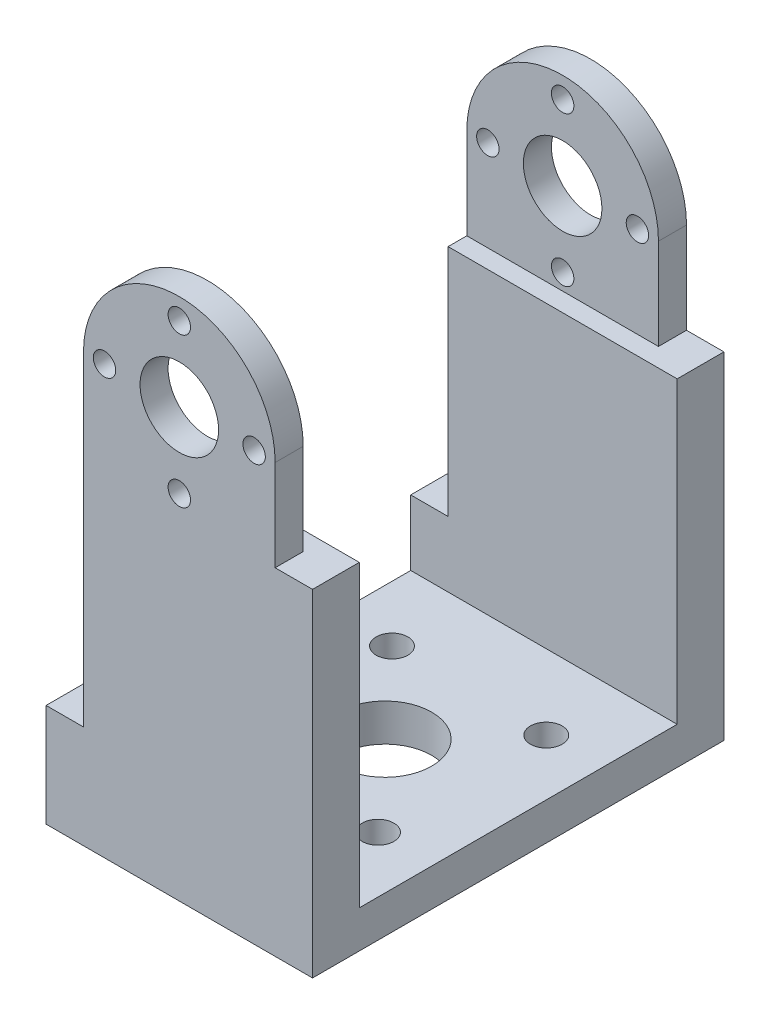
ISO-10303-21;
HEADER;
FILE_DESCRIPTION(('STEP AP214'),'2;1');
FILE_NAME('part.step','',(''),(''),'','','');
FILE_SCHEMA(('AUTOMOTIVE_DESIGN { 1 0 10303 214 1 1 1 1 }'));
ENDSEC;
DATA;
#1=APPLICATION_CONTEXT('core data for automotive mechanical design processes');
#2=APPLICATION_PROTOCOL_DEFINITION('international standard','automotive_design',2000,#1);
#3=PRODUCT_CONTEXT('',#1,'mechanical');
#4=PRODUCT('Part','Part','',(#3));
#5=PRODUCT_RELATED_PRODUCT_CATEGORY('part','',(#4));
#6=PRODUCT_DEFINITION_FORMATION('','',#4);
#7=PRODUCT_DEFINITION_CONTEXT('part definition',#1,'design');
#8=PRODUCT_DEFINITION('design','',#6,#7);
#9=PRODUCT_DEFINITION_SHAPE('','',#8);
#10=(LENGTH_UNIT() NAMED_UNIT(*) SI_UNIT(.MILLI.,.METRE.));
#11=(NAMED_UNIT(*) PLANE_ANGLE_UNIT() SI_UNIT($,.RADIAN.));
#12=(NAMED_UNIT(*) SI_UNIT($,.STERADIAN.) SOLID_ANGLE_UNIT());
#13=UNCERTAINTY_MEASURE_WITH_UNIT(LENGTH_MEASURE(1.E-05),#10,'distance_accuracy_value','');
#14=(GEOMETRIC_REPRESENTATION_CONTEXT(3) GLOBAL_UNCERTAINTY_ASSIGNED_CONTEXT((#13)) GLOBAL_UNIT_ASSIGNED_CONTEXT((#10,
#11,#12)) REPRESENTATION_CONTEXT('',''));
#15=CARTESIAN_POINT('',(0.,0.,0.));
#16=DIRECTION('',(0.,0.,1.));
#17=DIRECTION('',(1.,0.,0.));
#18=AXIS2_PLACEMENT_3D('',#15,#16,#17);
#19=CARTESIAN_POINT('',(17.25,-9.75,-17.));
#20=DIRECTION('',(0.,0.,-1.));
#21=DIRECTION('',(-1.,0.,0.));
#22=AXIS2_PLACEMENT_3D('',#19,#20,#21);
#23=PLANE('',#22);
#24=DIRECTION('',(0.,-1.,0.));
#25=VECTOR('',#24,1.);
#26=CARTESIAN_POINT('',(-10.25,-9.75,-17.));
#27=LINE('',#26,#25);
#28=CARTESIAN_POINT('',(-10.25,-9.75,-17.));
#29=VERTEX_POINT('',#28);
#30=CARTESIAN_POINT('',(-10.25,-34.75,-17.));
#31=VERTEX_POINT('',#30);
#32=EDGE_CURVE('E477',#29,#31,#27,.T.);
#33=ORIENTED_EDGE('',*,*,#32,.T.);
#34=DIRECTION('',(-1.,0.,0.));
#35=VECTOR('',#34,1.);
#36=CARTESIAN_POINT('',(17.25,-34.75,-17.));
#37=LINE('',#36,#35);
#38=CARTESIAN_POINT('',(-14.25,-34.75,-17.));
#39=VERTEX_POINT('',#38);
#40=EDGE_CURVE('E205',#31,#39,#37,.T.);
#41=ORIENTED_EDGE('',*,*,#40,.T.);
#42=DIRECTION('',(0.,-1.,0.));
#43=VECTOR('',#42,1.);
#44=CARTESIAN_POINT('',(-14.25,-9.74999999999999,-17.));
#45=LINE('',#44,#43);
#46=CARTESIAN_POINT('',(-14.25,-41.75,-17.));
#47=VERTEX_POINT('',#46);
#48=EDGE_CURVE('E218',#39,#47,#45,.T.);
#49=ORIENTED_EDGE('',*,*,#48,.T.);
#50=DIRECTION('',(1.,0.,0.));
#51=VECTOR('',#50,1.);
#52=CARTESIAN_POINT('',(0.,-41.75,-17.));
#53=LINE('',#52,#51);
#54=CARTESIAN_POINT('',(14.25,-41.75,-17.));
#55=VERTEX_POINT('',#54);
#56=EDGE_CURVE('E345',#47,#55,#53,.T.);
#57=ORIENTED_EDGE('',*,*,#56,.T.);
#58=DIRECTION('',(0.,1.,0.));
#59=VECTOR('',#58,1.);
#60=CARTESIAN_POINT('',(14.25,-9.75,-17.));
#61=LINE('',#60,#59);
#62=CARTESIAN_POINT('',(14.25,-9.75,-17.));
#63=VERTEX_POINT('',#62);
#64=EDGE_CURVE('E225',#55,#63,#61,.T.);
#65=ORIENTED_EDGE('',*,*,#64,.T.);
#66=DIRECTION('',(-1.,0.,0.));
#67=VECTOR('',#66,1.);
#68=CARTESIAN_POINT('',(17.25,-9.75,-17.));
#69=LINE('',#68,#67);
#70=EDGE_CURVE('E11',#63,#29,#69,.T.);
#71=ORIENTED_EDGE('',*,*,#70,.T.);
#72=EDGE_LOOP('',(#33,#41,#49,#57,#65,#71));
#73=FACE_BOUND('',#72,.T.);
#74=ADVANCED_FACE('F47',(#73),#23,.F.);
#75=CARTESIAN_POINT('',(10.25,-9.75,-19.));
#76=DIRECTION('',(0.,-1.,0.));
#77=DIRECTION('',(0.,0.,-1.));
#78=AXIS2_PLACEMENT_3D('',#75,#76,#77);
#79=PLANE('',#78);
#80=DIRECTION('',(-1.,0.,0.));
#81=VECTOR('',#80,1.);
#82=CARTESIAN_POINT('',(10.25,-9.75,-19.));
#83=LINE('',#82,#81);
#84=CARTESIAN_POINT('',(10.25,-9.75,-19.));
#85=VERTEX_POINT('',#84);
#86=CARTESIAN_POINT('',(-10.25,-9.75,-19.));
#87=VERTEX_POINT('',#86);
#88=EDGE_CURVE('E394',#85,#87,#83,.T.);
#89=ORIENTED_EDGE('',*,*,#88,.T.);
#90=DIRECTION('',(0.,0.,-1.));
#91=VECTOR('',#90,1.);
#92=CARTESIAN_POINT('',(-10.25,-9.75,22.));
#93=LINE('',#92,#91);
#94=EDGE_CURVE('E197',#29,#87,#93,.T.);
#95=ORIENTED_EDGE('',*,*,#94,.F.);
#96=ORIENTED_EDGE('',*,*,#70,.F.);
#97=DIRECTION('',(0.,0.,-1.));
#98=VECTOR('',#97,1.);
#99=CARTESIAN_POINT('',(14.25,-9.75,22.));
#100=LINE('',#99,#98);
#101=CARTESIAN_POINT('',(14.25,-9.75,-22.));
#102=VERTEX_POINT('',#101);
#103=EDGE_CURVE('E487',#63,#102,#100,.T.);
#104=ORIENTED_EDGE('',*,*,#103,.T.);
#105=DIRECTION('',(-1.,0.,0.));
#106=VECTOR('',#105,1.);
#107=CARTESIAN_POINT('',(10.25,-9.75,-22.));
#108=LINE('',#107,#106);
#109=CARTESIAN_POINT('',(10.25,-9.75,-22.));
#110=VERTEX_POINT('',#109);
#111=EDGE_CURVE('E349',#102,#110,#108,.T.);
#112=ORIENTED_EDGE('',*,*,#111,.T.);
#113=DIRECTION('',(0.,0.,1.));
#114=VECTOR('',#113,1.);
#115=CARTESIAN_POINT('',(10.25,-9.75,-22.));
#116=LINE('',#115,#114);
#117=EDGE_CURVE('E51',#110,#85,#116,.T.);
#118=ORIENTED_EDGE('',*,*,#117,.T.);
#119=EDGE_LOOP('',(#89,#95,#96,#104,#112,#118));
#120=FACE_BOUND('',#119,.T.);
#121=ADVANCED_FACE('F498',(#120),#79,.F.);
#122=CARTESIAN_POINT('',(0.,-45.75,0.));
#123=DIRECTION('',(0.,-1.,0.));
#124=DIRECTION('',(0.,0.,-1.));
#125=AXIS2_PLACEMENT_3D('',#122,#123,#124);
#126=PLANE('',#125);
#127=DIRECTION('',(0.,0.,-1.));
#128=VECTOR('',#127,1.);
#129=CARTESIAN_POINT('',(14.25,-45.75,0.));
#130=LINE('',#129,#128);
#131=CARTESIAN_POINT('',(14.25,-45.75,22.));
#132=VERTEX_POINT('',#131);
#133=CARTESIAN_POINT('',(14.25,-45.75,-22.));
#134=VERTEX_POINT('',#133);
#135=EDGE_CURVE('E369',#132,#134,#130,.T.);
#136=ORIENTED_EDGE('',*,*,#135,.F.);
#137=DIRECTION('',(1.,0.,0.));
#138=VECTOR('',#137,1.);
#139=CARTESIAN_POINT('',(-10.25,-45.75,22.));
#140=LINE('',#139,#138);
#141=CARTESIAN_POINT('',(-14.25,-45.75,22.));
#142=VERTEX_POINT('',#141);
#143=EDGE_CURVE('E241',#142,#132,#140,.T.);
#144=ORIENTED_EDGE('',*,*,#143,.F.);
#145=DIRECTION('',(0.,0.,-1.));
#146=VECTOR('',#145,1.);
#147=CARTESIAN_POINT('',(-14.25,-45.75,0.));
#148=LINE('',#147,#146);
#149=CARTESIAN_POINT('',(-14.25,-45.75,-22.));
#150=VERTEX_POINT('',#149);
#151=EDGE_CURVE('E201',#142,#150,#148,.T.);
#152=ORIENTED_EDGE('',*,*,#151,.T.);
#153=DIRECTION('',(-1.,0.,0.));
#154=VECTOR('',#153,1.);
#155=CARTESIAN_POINT('',(10.25,-45.75,-22.));
#156=LINE('',#155,#154);
#157=EDGE_CURVE('E389',#134,#150,#156,.T.);
#158=ORIENTED_EDGE('',*,*,#157,.F.);
#159=EDGE_LOOP('',(#136,#144,#152,#158));
#160=FACE_BOUND('',#159,.T.);
#161=CARTESIAN_POINT('',(-8.24999999999981,-45.75,-8.99999999999999));
#162=DIRECTION('',(0.,-1.,0.));
#163=DIRECTION('',(0.,0.,-1.));
#164=AXIS2_PLACEMENT_3D('',#161,#162,#163);
#165=CIRCLE('',#164,1.7);
#166=CARTESIAN_POINT('',(-8.24999999999981,-45.75,-10.7));
#167=VERTEX_POINT('',#166);
#168=EDGE_CURVE('E307',#167,#167,#165,.T.);
#169=ORIENTED_EDGE('',*,*,#168,.F.);
#170=EDGE_LOOP('',(#169));
#171=FACE_BOUND('',#170,.T.);
#172=CARTESIAN_POINT('',(8.2500000000002,-45.75,-8.99999999999999));
#173=DIRECTION('',(0.,-1.,0.));
#174=DIRECTION('',(0.,0.,-1.));
#175=AXIS2_PLACEMENT_3D('',#172,#173,#174);
#176=CIRCLE('',#175,1.7);
#177=CARTESIAN_POINT('',(8.2500000000002,-45.75,-10.7));
#178=VERTEX_POINT('',#177);
#179=EDGE_CURVE('E353',#178,#178,#176,.T.);
#180=ORIENTED_EDGE('',*,*,#179,.F.);
#181=EDGE_LOOP('',(#180));
#182=FACE_BOUND('',#181,.T.);
#183=CARTESIAN_POINT('',(8.25000000000001,-45.75,9.00000000000001));
#184=DIRECTION('',(0.,-1.,0.));
#185=DIRECTION('',(0.,0.,-1.));
#186=AXIS2_PLACEMENT_3D('',#183,#184,#185);
#187=CIRCLE('',#186,1.7);
#188=CARTESIAN_POINT('',(8.25000000000001,-45.75,7.30000000000001));
#189=VERTEX_POINT('',#188);
#190=EDGE_CURVE('E357',#189,#189,#187,.T.);
#191=ORIENTED_EDGE('',*,*,#190,.F.);
#192=EDGE_LOOP('',(#191));
#193=FACE_BOUND('',#192,.T.);
#194=CARTESIAN_POINT('',(-8.24999999999999,-45.75,9.00000000000001));
#195=DIRECTION('',(0.,-1.,0.));
#196=DIRECTION('',(0.,0.,-1.));
#197=AXIS2_PLACEMENT_3D('',#194,#195,#196);
#198=CIRCLE('',#197,1.7);
#199=CARTESIAN_POINT('',(-8.24999999999999,-45.75,7.30000000000001));
#200=VERTEX_POINT('',#199);
#201=EDGE_CURVE('E361',#200,#200,#198,.T.);
#202=ORIENTED_EDGE('',*,*,#201,.F.);
#203=EDGE_LOOP('',(#202));
#204=FACE_BOUND('',#203,.T.);
#205=CARTESIAN_POINT('',(0.,-45.75,0.));
#206=DIRECTION('',(0.,-1.,0.));
#207=DIRECTION('',(0.,0.,-1.));
#208=AXIS2_PLACEMENT_3D('',#205,#206,#207);
#209=CIRCLE('',#208,5.);
#210=CARTESIAN_POINT('',(0.,-45.75,-5.));
#211=VERTEX_POINT('',#210);
#212=EDGE_CURVE('E365',#211,#211,#209,.T.);
#213=ORIENTED_EDGE('',*,*,#212,.F.);
#214=EDGE_LOOP('',(#213));
#215=FACE_BOUND('',#214,.T.);
#216=ADVANCED_FACE('F49',(#160,#171,#182,#193,#204,#215),#126,.T.);
#217=CARTESIAN_POINT('',(-10.25,0.,-22.));
#218=DIRECTION('',(-1.,0.,0.));
#219=DIRECTION('',(0.,0.,1.));
#220=AXIS2_PLACEMENT_3D('',#217,#218,#219);
#221=PLANE('',#220);
#222=DIRECTION('',(0.,-1.,0.));
#223=VECTOR('',#222,1.);
#224=CARTESIAN_POINT('',(-10.25,0.,-22.));
#225=LINE('',#224,#223);
#226=CARTESIAN_POINT('',(-10.25,0.,-22.));
#227=VERTEX_POINT('',#226);
#228=CARTESIAN_POINT('',(-10.25,-34.75,-22.));
#229=VERTEX_POINT('',#228);
#230=EDGE_CURVE('E390',#227,#229,#225,.T.);
#231=ORIENTED_EDGE('',*,*,#230,.T.);
#232=DIRECTION('',(0.,0.,-1.));
#233=VECTOR('',#232,1.);
#234=CARTESIAN_POINT('',(-10.25,-34.75,22.));
#235=LINE('',#234,#233);
#236=EDGE_CURVE('E472',#31,#229,#235,.T.);
#237=ORIENTED_EDGE('',*,*,#236,.F.);
#238=ORIENTED_EDGE('',*,*,#32,.F.);
#239=ORIENTED_EDGE('',*,*,#94,.T.);
#240=DIRECTION('',(0.,-1.,0.));
#241=VECTOR('',#240,1.);
#242=CARTESIAN_POINT('',(-10.25,10.25,-19.));
#243=LINE('',#242,#241);
#244=CARTESIAN_POINT('',(-10.25,0.,-19.));
#245=VERTEX_POINT('',#244);
#246=EDGE_CURVE('E57',#245,#87,#243,.T.);
#247=ORIENTED_EDGE('',*,*,#246,.F.);
#248=DIRECTION('',(0.,0.,1.));
#249=VECTOR('',#248,1.);
#250=CARTESIAN_POINT('',(-10.25,0.,-22.));
#251=LINE('',#250,#249);
#252=EDGE_CURVE('E398',#227,#245,#251,.T.);
#253=ORIENTED_EDGE('',*,*,#252,.F.);
#254=EDGE_LOOP('',(#231,#237,#238,#239,#247,#253));
#255=FACE_BOUND('',#254,.T.);
#256=ADVANCED_FACE('F458',(#255),#221,.T.);
#257=CARTESIAN_POINT('',(0.,0.,-22.));
#258=DIRECTION('',(0.,0.,1.));
#259=DIRECTION('',(1.,0.,0.));
#260=AXIS2_PLACEMENT_3D('',#257,#258,#259);
#261=CYLINDRICAL_SURFACE('',#260,10.25);
#262=CARTESIAN_POINT('',(0.,0.,-19.));
#263=DIRECTION('',(0.,0.,-1.));
#264=DIRECTION('',(-1.,0.,0.));
#265=AXIS2_PLACEMENT_3D('',#262,#263,#264);
#266=CIRCLE('',#265,10.25);
#267=CARTESIAN_POINT('',(10.25,0.,-19.));
#268=VERTEX_POINT('',#267);
#269=EDGE_CURVE('E384',#268,#245,#266,.F.);
#270=ORIENTED_EDGE('',*,*,#269,.F.);
#271=DIRECTION('',(0.,0.,1.));
#272=VECTOR('',#271,1.);
#273=CARTESIAN_POINT('',(10.25,0.,-22.));
#274=LINE('',#273,#272);
#275=CARTESIAN_POINT('',(10.25,0.,-22.));
#276=VERTEX_POINT('',#275);
#277=EDGE_CURVE('E415',#276,#268,#274,.T.);
#278=ORIENTED_EDGE('',*,*,#277,.F.);
#279=CARTESIAN_POINT('',(0.,0.,-22.));
#280=DIRECTION('',(0.,0.,1.));
#281=DIRECTION('',(1.,0.,0.));
#282=AXIS2_PLACEMENT_3D('',#279,#280,#281);
#283=CIRCLE('',#282,10.25);
#284=EDGE_CURVE('E393',#276,#227,#283,.T.);
#285=ORIENTED_EDGE('',*,*,#284,.T.);
#286=ORIENTED_EDGE('',*,*,#252,.T.);
#287=EDGE_LOOP('',(#270,#278,#285,#286));
#288=FACE_BOUND('',#287,.T.);
#289=ADVANCED_FACE('F453',(#288),#261,.T.);
#290=CARTESIAN_POINT('',(0.,0.,-22.));
#291=DIRECTION('',(0.,0.,1.));
#292=DIRECTION('',(1.,0.,0.));
#293=AXIS2_PLACEMENT_3D('',#290,#291,#292);
#294=CYLINDRICAL_SURFACE('',#293,4.2);
#295=CARTESIAN_POINT('',(0.,0.,-19.));
#296=DIRECTION('',(0.,0.,-1.));
#297=DIRECTION('',(-1.,0.,0.));
#298=AXIS2_PLACEMENT_3D('',#295,#296,#297);
#299=CIRCLE('',#298,4.2);
#300=CARTESIAN_POINT('',(-4.2,0.,-19.));
#301=VERTEX_POINT('',#300);
#302=EDGE_CURVE('E418',#301,#301,#299,.F.);
#303=ORIENTED_EDGE('',*,*,#302,.T.);
#304=EDGE_LOOP('',(#303));
#305=FACE_BOUND('',#304,.T.);
#306=CARTESIAN_POINT('',(0.,0.,-22.));
#307=DIRECTION('',(0.,0.,1.));
#308=DIRECTION('',(1.,0.,0.));
#309=AXIS2_PLACEMENT_3D('',#306,#307,#308);
#310=CIRCLE('',#309,4.2);
#311=CARTESIAN_POINT('',(4.2,0.,-22.));
#312=VERTEX_POINT('',#311);
#313=EDGE_CURVE('E399',#312,#312,#310,.T.);
#314=ORIENTED_EDGE('',*,*,#313,.F.);
#315=EDGE_LOOP('',(#314));
#316=FACE_BOUND('',#315,.T.);
#317=ADVANCED_FACE('F525',(#305,#316),#294,.F.);
#318=CARTESIAN_POINT('',(8.,0.,-22.));
#319=DIRECTION('',(0.,0.,1.));
#320=DIRECTION('',(1.,0.,0.));
#321=AXIS2_PLACEMENT_3D('',#318,#319,#320);
#322=CYLINDRICAL_SURFACE('',#321,1.2);
#323=CARTESIAN_POINT('',(8.,0.,-19.));
#324=DIRECTION('',(0.,0.,-1.));
#325=DIRECTION('',(-1.,0.,0.));
#326=AXIS2_PLACEMENT_3D('',#323,#324,#325);
#327=CIRCLE('',#326,1.2);
#328=CARTESIAN_POINT('',(6.8,0.,-19.));
#329=VERTEX_POINT('',#328);
#330=EDGE_CURVE('E422',#329,#329,#327,.F.);
#331=ORIENTED_EDGE('',*,*,#330,.T.);
#332=EDGE_LOOP('',(#331));
#333=FACE_BOUND('',#332,.T.);
#334=CARTESIAN_POINT('',(8.,0.,-22.));
#335=DIRECTION('',(0.,0.,1.));
#336=DIRECTION('',(1.,0.,0.));
#337=AXIS2_PLACEMENT_3D('',#334,#335,#336);
#338=CIRCLE('',#337,1.2);
#339=CARTESIAN_POINT('',(9.2,0.,-22.));
#340=VERTEX_POINT('',#339);
#341=EDGE_CURVE('E403',#340,#340,#338,.T.);
#342=ORIENTED_EDGE('',*,*,#341,.F.);
#343=EDGE_LOOP('',(#342));
#344=FACE_BOUND('',#343,.T.);
#345=ADVANCED_FACE('F528',(#333,#344),#322,.F.);
#346=CARTESIAN_POINT('',(0.,8.,-22.));
#347=DIRECTION('',(0.,0.,1.));
#348=DIRECTION('',(1.,0.,0.));
#349=AXIS2_PLACEMENT_3D('',#346,#347,#348);
#350=CYLINDRICAL_SURFACE('',#349,1.2);
#351=CARTESIAN_POINT('',(0.,8.,-19.));
#352=DIRECTION('',(0.,0.,-1.));
#353=DIRECTION('',(-1.,0.,0.));
#354=AXIS2_PLACEMENT_3D('',#351,#352,#353);
#355=CIRCLE('',#354,1.2);
#356=CARTESIAN_POINT('',(-1.2,8.,-19.));
#357=VERTEX_POINT('',#356);
#358=EDGE_CURVE('E426',#357,#357,#355,.F.);
#359=ORIENTED_EDGE('',*,*,#358,.T.);
#360=EDGE_LOOP('',(#359));
#361=FACE_BOUND('',#360,.T.);
#362=CARTESIAN_POINT('',(0.,8.,-22.));
#363=DIRECTION('',(0.,0.,1.));
#364=DIRECTION('',(1.,0.,0.));
#365=AXIS2_PLACEMENT_3D('',#362,#363,#364);
#366=CIRCLE('',#365,1.2);
#367=CARTESIAN_POINT('',(1.2,8.,-22.));
#368=VERTEX_POINT('',#367);
#369=EDGE_CURVE('E407',#368,#368,#366,.T.);
#370=ORIENTED_EDGE('',*,*,#369,.F.);
#371=EDGE_LOOP('',(#370));
#372=FACE_BOUND('',#371,.T.);
#373=ADVANCED_FACE('F557',(#361,#372),#350,.F.);
#374=CARTESIAN_POINT('',(-8.,0.,-22.));
#375=DIRECTION('',(0.,0.,1.));
#376=DIRECTION('',(1.,0.,0.));
#377=AXIS2_PLACEMENT_3D('',#374,#375,#376);
#378=CYLINDRICAL_SURFACE('',#377,1.2);
#379=CARTESIAN_POINT('',(-8.,0.,-19.));
#380=DIRECTION('',(0.,0.,-1.));
#381=DIRECTION('',(-1.,0.,0.));
#382=AXIS2_PLACEMENT_3D('',#379,#380,#381);
#383=CIRCLE('',#382,1.2);
#384=CARTESIAN_POINT('',(-9.2,0.,-19.));
#385=VERTEX_POINT('',#384);
#386=EDGE_CURVE('E379',#385,#385,#383,.F.);
#387=ORIENTED_EDGE('',*,*,#386,.T.);
#388=EDGE_LOOP('',(#387));
#389=FACE_BOUND('',#388,.T.);
#390=CARTESIAN_POINT('',(-8.,0.,-22.));
#391=DIRECTION('',(0.,0.,1.));
#392=DIRECTION('',(1.,0.,0.));
#393=AXIS2_PLACEMENT_3D('',#390,#391,#392);
#394=CIRCLE('',#393,1.2);
#395=CARTESIAN_POINT('',(-6.8,0.,-22.));
#396=VERTEX_POINT('',#395);
#397=EDGE_CURVE('E411',#396,#396,#394,.T.);
#398=ORIENTED_EDGE('',*,*,#397,.F.);
#399=EDGE_LOOP('',(#398));
#400=FACE_BOUND('',#399,.T.);
#401=ADVANCED_FACE('F552',(#389,#400),#378,.F.);
#402=CARTESIAN_POINT('',(0.,-8.,-22.));
#403=DIRECTION('',(0.,0.,1.));
#404=DIRECTION('',(1.,0.,0.));
#405=AXIS2_PLACEMENT_3D('',#402,#403,#404);
#406=CYLINDRICAL_SURFACE('',#405,1.2);
#407=CARTESIAN_POINT('',(0.,-8.,-19.));
#408=DIRECTION('',(0.,0.,-1.));
#409=DIRECTION('',(-1.,0.,0.));
#410=AXIS2_PLACEMENT_3D('',#407,#408,#409);
#411=CIRCLE('',#410,1.2);
#412=CARTESIAN_POINT('',(-1.20000000000006,-8.,-19.));
#413=VERTEX_POINT('',#412);
#414=EDGE_CURVE('E374',#413,#413,#411,.F.);
#415=ORIENTED_EDGE('',*,*,#414,.T.);
#416=EDGE_LOOP('',(#415));
#417=FACE_BOUND('',#416,.T.);
#418=CARTESIAN_POINT('',(0.,-8.,-22.));
#419=DIRECTION('',(0.,0.,1.));
#420=DIRECTION('',(1.,0.,0.));
#421=AXIS2_PLACEMENT_3D('',#418,#419,#420);
#422=CIRCLE('',#421,1.2);
#423=CARTESIAN_POINT('',(1.19999999999994,-8.,-22.));
#424=VERTEX_POINT('',#423);
#425=EDGE_CURVE('E380',#424,#424,#422,.T.);
#426=ORIENTED_EDGE('',*,*,#425,.F.);
#427=EDGE_LOOP('',(#426));
#428=FACE_BOUND('',#427,.T.);
#429=ADVANCED_FACE('F539',(#417,#428),#406,.F.);
#430=CARTESIAN_POINT('',(10.25,0.,-22.));
#431=DIRECTION('',(-1.,0.,0.));
#432=DIRECTION('',(0.,0.,1.));
#433=AXIS2_PLACEMENT_3D('',#430,#431,#432);
#434=PLANE('',#433);
#435=DIRECTION('',(0.,-1.,0.));
#436=VECTOR('',#435,1.);
#437=CARTESIAN_POINT('',(10.25,10.25,-19.));
#438=LINE('',#437,#436);
#439=EDGE_CURVE('E378',#268,#85,#438,.T.);
#440=ORIENTED_EDGE('',*,*,#439,.T.);
#441=ORIENTED_EDGE('',*,*,#117,.F.);
#442=DIRECTION('',(0.,-1.,0.));
#443=VECTOR('',#442,1.);
#444=CARTESIAN_POINT('',(10.25,0.,-22.));
#445=LINE('',#444,#443);
#446=EDGE_CURVE('E385',#276,#110,#445,.T.);
#447=ORIENTED_EDGE('',*,*,#446,.F.);
#448=ORIENTED_EDGE('',*,*,#277,.T.);
#449=EDGE_LOOP('',(#440,#441,#447,#448));
#450=FACE_BOUND('',#449,.T.);
#451=ADVANCED_FACE('F507',(#450),#434,.F.);
#452=CARTESIAN_POINT('',(0.,0.,-22.));
#453=DIRECTION('',(0.,0.,1.));
#454=DIRECTION('',(1.,0.,0.));
#455=AXIS2_PLACEMENT_3D('',#452,#453,#454);
#456=PLANE('',#455);
#457=ORIENTED_EDGE('',*,*,#397,.T.);
#458=EDGE_LOOP('',(#457));
#459=FACE_BOUND('',#458,.T.);
#460=ORIENTED_EDGE('',*,*,#369,.T.);
#461=EDGE_LOOP('',(#460));
#462=FACE_BOUND('',#461,.T.);
#463=ORIENTED_EDGE('',*,*,#341,.T.);
#464=EDGE_LOOP('',(#463));
#465=FACE_BOUND('',#464,.T.);
#466=ORIENTED_EDGE('',*,*,#313,.T.);
#467=EDGE_LOOP('',(#466));
#468=FACE_BOUND('',#467,.T.);
#469=DIRECTION('',(0.,-1.,0.));
#470=VECTOR('',#469,1.);
#471=CARTESIAN_POINT('',(-14.25,-9.75,-22.));
#472=LINE('',#471,#470);
#473=CARTESIAN_POINT('',(-14.25,-34.75,-22.));
#474=VERTEX_POINT('',#473);
#475=EDGE_CURVE('E204',#474,#150,#472,.T.);
#476=ORIENTED_EDGE('',*,*,#475,.F.);
#477=DIRECTION('',(-1.,0.,0.));
#478=VECTOR('',#477,1.);
#479=CARTESIAN_POINT('',(-10.25,-34.75,-22.));
#480=LINE('',#479,#478);
#481=EDGE_CURVE('E65',#229,#474,#480,.T.);
#482=ORIENTED_EDGE('',*,*,#481,.F.);
#483=ORIENTED_EDGE('',*,*,#230,.F.);
#484=ORIENTED_EDGE('',*,*,#284,.F.);
#485=ORIENTED_EDGE('',*,*,#446,.T.);
#486=ORIENTED_EDGE('',*,*,#111,.F.);
#487=DIRECTION('',(0.,1.,0.));
#488=VECTOR('',#487,1.);
#489=CARTESIAN_POINT('',(14.25,-9.75,-22.));
#490=LINE('',#489,#488);
#491=EDGE_CURVE('E209',#134,#102,#490,.T.);
#492=ORIENTED_EDGE('',*,*,#491,.F.);
#493=ORIENTED_EDGE('',*,*,#157,.T.);
#494=EDGE_LOOP('',(#476,#482,#483,#484,#485,#486,#492,#493));
#495=FACE_BOUND('',#494,.T.);
#496=ORIENTED_EDGE('',*,*,#425,.T.);
#497=EDGE_LOOP('',(#496));
#498=FACE_BOUND('',#497,.T.);
#499=ADVANCED_FACE('F462',(#459,#462,#465,#468,#495,#498),#456,.F.);
#500=CARTESIAN_POINT('',(10.25,10.25,-19.));
#501=DIRECTION('',(0.,0.,-1.));
#502=DIRECTION('',(-1.,0.,0.));
#503=AXIS2_PLACEMENT_3D('',#500,#501,#502);
#504=PLANE('',#503);
#505=ORIENTED_EDGE('',*,*,#269,.T.);
#506=ORIENTED_EDGE('',*,*,#246,.T.);
#507=ORIENTED_EDGE('',*,*,#88,.F.);
#508=ORIENTED_EDGE('',*,*,#439,.F.);
#509=EDGE_LOOP('',(#505,#506,#507,#508));
#510=FACE_BOUND('',#509,.T.);
#511=ORIENTED_EDGE('',*,*,#330,.F.);
#512=EDGE_LOOP('',(#511));
#513=FACE_BOUND('',#512,.T.);
#514=ORIENTED_EDGE('',*,*,#386,.F.);
#515=EDGE_LOOP('',(#514));
#516=FACE_BOUND('',#515,.T.);
#517=ORIENTED_EDGE('',*,*,#414,.F.);
#518=EDGE_LOOP('',(#517));
#519=FACE_BOUND('',#518,.T.);
#520=ORIENTED_EDGE('',*,*,#358,.F.);
#521=EDGE_LOOP('',(#520));
#522=FACE_BOUND('',#521,.T.);
#523=ORIENTED_EDGE('',*,*,#302,.F.);
#524=EDGE_LOOP('',(#523));
#525=FACE_BOUND('',#524,.T.);
#526=ADVANCED_FACE('F510',(#510,#513,#516,#519,#522,#525),#504,.F.);
#527=CARTESIAN_POINT('',(14.25,-41.75,0.));
#528=DIRECTION('',(-1.,0.,0.));
#529=DIRECTION('',(0.,0.,1.));
#530=AXIS2_PLACEMENT_3D('',#527,#528,#529);
#531=PLANE('',#530);
#532=ORIENTED_EDGE('',*,*,#135,.T.);
#533=ORIENTED_EDGE('',*,*,#491,.T.);
#534=ORIENTED_EDGE('',*,*,#103,.F.);
#535=ORIENTED_EDGE('',*,*,#64,.F.);
#536=DIRECTION('',(0.,0.,-1.));
#537=VECTOR('',#536,1.);
#538=CARTESIAN_POINT('',(14.25,-41.75,0.));
#539=LINE('',#538,#537);
#540=CARTESIAN_POINT('',(14.25,-41.75,17.));
#541=VERTEX_POINT('',#540);
#542=EDGE_CURVE('E333',#541,#55,#539,.T.);
#543=ORIENTED_EDGE('',*,*,#542,.F.);
#544=DIRECTION('',(0.,-1.,0.));
#545=VECTOR('',#544,1.);
#546=CARTESIAN_POINT('',(14.25,-9.75,17.));
#547=LINE('',#546,#545);
#548=CARTESIAN_POINT('',(14.25,-9.75,17.));
#549=VERTEX_POINT('',#548);
#550=EDGE_CURVE('E222',#549,#541,#547,.T.);
#551=ORIENTED_EDGE('',*,*,#550,.F.);
#552=CARTESIAN_POINT('',(14.25,-9.75,22.));
#553=VERTEX_POINT('',#552);
#554=EDGE_CURVE('E219',#553,#549,#100,.T.);
#555=ORIENTED_EDGE('',*,*,#554,.F.);
#556=DIRECTION('',(0.,1.,0.));
#557=VECTOR('',#556,1.);
#558=CARTESIAN_POINT('',(14.25,-9.75,22.));
#559=LINE('',#558,#557);
#560=EDGE_CURVE('E483',#132,#553,#559,.T.);
#561=ORIENTED_EDGE('',*,*,#560,.F.);
#562=EDGE_LOOP('',(#532,#533,#534,#535,#543,#551,#555,#561));
#563=FACE_BOUND('',#562,.T.);
#564=ADVANCED_FACE('F513',(#563),#531,.F.);
#565=CARTESIAN_POINT('',(-14.25,-41.75,0.));
#566=DIRECTION('',(-1.,0.,0.));
#567=DIRECTION('',(0.,0.,1.));
#568=AXIS2_PLACEMENT_3D('',#565,#566,#567);
#569=PLANE('',#568);
#570=DIRECTION('',(0.,0.,-1.));
#571=VECTOR('',#570,1.);
#572=CARTESIAN_POINT('',(-14.25,-34.75,22.));
#573=LINE('',#572,#571);
#574=EDGE_CURVE('E189',#39,#474,#573,.T.);
#575=ORIENTED_EDGE('',*,*,#574,.T.);
#576=ORIENTED_EDGE('',*,*,#475,.T.);
#577=ORIENTED_EDGE('',*,*,#151,.F.);
#578=DIRECTION('',(0.,-1.,0.));
#579=VECTOR('',#578,1.);
#580=CARTESIAN_POINT('',(-14.25,-9.75,22.));
#581=LINE('',#580,#579);
#582=CARTESIAN_POINT('',(-14.25,-34.75,22.));
#583=VERTEX_POINT('',#582);
#584=EDGE_CURVE('E194',#583,#142,#581,.T.);
#585=ORIENTED_EDGE('',*,*,#584,.F.);
#586=CARTESIAN_POINT('',(-14.25,-34.75,17.));
#587=VERTEX_POINT('',#586);
#588=EDGE_CURVE('E177',#583,#587,#573,.T.);
#589=ORIENTED_EDGE('',*,*,#588,.T.);
#590=DIRECTION('',(0.,1.,0.));
#591=VECTOR('',#590,1.);
#592=CARTESIAN_POINT('',(-14.25,-9.74999999999999,17.));
#593=LINE('',#592,#591);
#594=CARTESIAN_POINT('',(-14.25,-41.75,17.));
#595=VERTEX_POINT('',#594);
#596=EDGE_CURVE('E215',#595,#587,#593,.T.);
#597=ORIENTED_EDGE('',*,*,#596,.F.);
#598=DIRECTION('',(0.,0.,-1.));
#599=VECTOR('',#598,1.);
#600=CARTESIAN_POINT('',(-14.25,-41.75,0.));
#601=LINE('',#600,#599);
#602=EDGE_CURVE('E341',#595,#47,#601,.T.);
#603=ORIENTED_EDGE('',*,*,#602,.T.);
#604=ORIENTED_EDGE('',*,*,#48,.F.);
#605=EDGE_LOOP('',(#575,#576,#577,#585,#589,#597,#603,#604));
#606=FACE_BOUND('',#605,.T.);
#607=ADVANCED_FACE('F199',(#606),#569,.T.);
#608=CARTESIAN_POINT('',(0.,-41.75,0.));
#609=DIRECTION('',(0.,-1.,0.));
#610=DIRECTION('',(0.,0.,-1.));
#611=AXIS2_PLACEMENT_3D('',#608,#609,#610);
#612=CYLINDRICAL_SURFACE('',#611,5.);
#613=CARTESIAN_POINT('',(0.,-41.75,0.));
#614=DIRECTION('',(0.,-1.,0.));
#615=DIRECTION('',(0.,0.,-1.));
#616=AXIS2_PLACEMENT_3D('',#613,#614,#615);
#617=CIRCLE('',#616,5.);
#618=CARTESIAN_POINT('',(0.,-41.75,-5.));
#619=VERTEX_POINT('',#618);
#620=EDGE_CURVE('E329',#619,#619,#617,.T.);
#621=ORIENTED_EDGE('',*,*,#620,.F.);
#622=EDGE_LOOP('',(#621));
#623=FACE_BOUND('',#622,.T.);
#624=ORIENTED_EDGE('',*,*,#212,.T.);
#625=EDGE_LOOP('',(#624));
#626=FACE_BOUND('',#625,.T.);
#627=ADVANCED_FACE('F599',(#623,#626),#612,.F.);
#628=CARTESIAN_POINT('',(-8.24999999999999,-41.75,9.00000000000001));
#629=DIRECTION('',(0.,-1.,0.));
#630=DIRECTION('',(0.,0.,-1.));
#631=AXIS2_PLACEMENT_3D('',#628,#629,#630);
#632=CYLINDRICAL_SURFACE('',#631,1.7);
#633=CARTESIAN_POINT('',(-8.24999999999999,-41.75,9.00000000000001));
#634=DIRECTION('',(0.,-1.,0.));
#635=DIRECTION('',(0.,0.,-1.));
#636=AXIS2_PLACEMENT_3D('',#633,#634,#635);
#637=CIRCLE('',#636,1.7);
#638=CARTESIAN_POINT('',(-8.24999999999999,-41.75,7.30000000000001));
#639=VERTEX_POINT('',#638);
#640=EDGE_CURVE('E325',#639,#639,#637,.T.);
#641=ORIENTED_EDGE('',*,*,#640,.F.);
#642=EDGE_LOOP('',(#641));
#643=FACE_BOUND('',#642,.T.);
#644=ORIENTED_EDGE('',*,*,#201,.T.);
#645=EDGE_LOOP('',(#644));
#646=FACE_BOUND('',#645,.T.);
#647=ADVANCED_FACE('F603',(#643,#646),#632,.F.);
#648=CARTESIAN_POINT('',(8.25000000000001,-41.75,9.00000000000001));
#649=DIRECTION('',(0.,-1.,0.));
#650=DIRECTION('',(0.,0.,-1.));
#651=AXIS2_PLACEMENT_3D('',#648,#649,#650);
#652=CYLINDRICAL_SURFACE('',#651,1.7);
#653=CARTESIAN_POINT('',(8.25000000000001,-41.75,9.00000000000001));
#654=DIRECTION('',(0.,-1.,0.));
#655=DIRECTION('',(0.,0.,-1.));
#656=AXIS2_PLACEMENT_3D('',#653,#654,#655);
#657=CIRCLE('',#656,1.7);
#658=CARTESIAN_POINT('',(8.25000000000001,-41.75,7.30000000000001));
#659=VERTEX_POINT('',#658);
#660=EDGE_CURVE('E321',#659,#659,#657,.T.);
#661=ORIENTED_EDGE('',*,*,#660,.F.);
#662=EDGE_LOOP('',(#661));
#663=FACE_BOUND('',#662,.T.);
#664=ORIENTED_EDGE('',*,*,#190,.T.);
#665=EDGE_LOOP('',(#664));
#666=FACE_BOUND('',#665,.T.);
#667=ADVANCED_FACE('F613',(#663,#666),#652,.F.);
#668=CARTESIAN_POINT('',(8.2500000000002,-41.75,-8.99999999999999));
#669=DIRECTION('',(0.,-1.,0.));
#670=DIRECTION('',(0.,0.,-1.));
#671=AXIS2_PLACEMENT_3D('',#668,#669,#670);
#672=CYLINDRICAL_SURFACE('',#671,1.7);
#673=CARTESIAN_POINT('',(8.2500000000002,-41.75,-8.99999999999999));
#674=DIRECTION('',(0.,-1.,0.));
#675=DIRECTION('',(0.,0.,-1.));
#676=AXIS2_PLACEMENT_3D('',#673,#674,#675);
#677=CIRCLE('',#676,1.7);
#678=CARTESIAN_POINT('',(8.2500000000002,-41.75,-10.7));
#679=VERTEX_POINT('',#678);
#680=EDGE_CURVE('E317',#679,#679,#677,.T.);
#681=ORIENTED_EDGE('',*,*,#680,.F.);
#682=EDGE_LOOP('',(#681));
#683=FACE_BOUND('',#682,.T.);
#684=ORIENTED_EDGE('',*,*,#179,.T.);
#685=EDGE_LOOP('',(#684));
#686=FACE_BOUND('',#685,.T.);
#687=ADVANCED_FACE('F622',(#683,#686),#672,.F.);
#688=CARTESIAN_POINT('',(-8.24999999999981,-41.75,-8.99999999999999));
#689=DIRECTION('',(0.,-1.,0.));
#690=DIRECTION('',(0.,0.,-1.));
#691=AXIS2_PLACEMENT_3D('',#688,#689,#690);
#692=CYLINDRICAL_SURFACE('',#691,1.7);
#693=CARTESIAN_POINT('',(-8.24999999999981,-41.75,-8.99999999999999));
#694=DIRECTION('',(0.,-1.,0.));
#695=DIRECTION('',(0.,0.,-1.));
#696=AXIS2_PLACEMENT_3D('',#693,#694,#695);
#697=CIRCLE('',#696,1.7);
#698=CARTESIAN_POINT('',(-8.24999999999981,-41.75,-10.7));
#699=VERTEX_POINT('',#698);
#700=EDGE_CURVE('E313',#699,#699,#697,.T.);
#701=ORIENTED_EDGE('',*,*,#700,.F.);
#702=EDGE_LOOP('',(#701));
#703=FACE_BOUND('',#702,.T.);
#704=ORIENTED_EDGE('',*,*,#168,.T.);
#705=EDGE_LOOP('',(#704));
#706=FACE_BOUND('',#705,.T.);
#707=ADVANCED_FACE('F631',(#703,#706),#692,.F.);
#708=CARTESIAN_POINT('',(0.,-41.75,0.));
#709=DIRECTION('',(0.,-1.,0.));
#710=DIRECTION('',(0.,0.,-1.));
#711=AXIS2_PLACEMENT_3D('',#708,#709,#710);
#712=PLANE('',#711);
#713=ORIENTED_EDGE('',*,*,#700,.T.);
#714=EDGE_LOOP('',(#713));
#715=FACE_BOUND('',#714,.T.);
#716=ORIENTED_EDGE('',*,*,#680,.T.);
#717=EDGE_LOOP('',(#716));
#718=FACE_BOUND('',#717,.T.);
#719=ORIENTED_EDGE('',*,*,#660,.T.);
#720=EDGE_LOOP('',(#719));
#721=FACE_BOUND('',#720,.T.);
#722=ORIENTED_EDGE('',*,*,#640,.T.);
#723=EDGE_LOOP('',(#722));
#724=FACE_BOUND('',#723,.T.);
#725=ORIENTED_EDGE('',*,*,#620,.T.);
#726=EDGE_LOOP('',(#725));
#727=FACE_BOUND('',#726,.T.);
#728=ORIENTED_EDGE('',*,*,#542,.T.);
#729=ORIENTED_EDGE('',*,*,#56,.F.);
#730=ORIENTED_EDGE('',*,*,#602,.F.);
#731=DIRECTION('',(1.,0.,0.));
#732=VECTOR('',#731,1.);
#733=CARTESIAN_POINT('',(0.,-41.75,17.));
#734=LINE('',#733,#732);
#735=EDGE_CURVE('E337',#595,#541,#734,.T.);
#736=ORIENTED_EDGE('',*,*,#735,.T.);
#737=EDGE_LOOP('',(#728,#729,#730,#736));
#738=FACE_BOUND('',#737,.T.);
#739=ADVANCED_FACE('F640',(#715,#718,#721,#724,#727,#738),#712,.F.);
#740=CARTESIAN_POINT('',(10.25,10.25,19.));
#741=DIRECTION('',(0.,0.,1.));
#742=DIRECTION('',(0.,-1.,0.));
#743=AXIS2_PLACEMENT_3D('',#740,#741,#742);
#744=PLANE('',#743);
#745=CARTESIAN_POINT('',(0.,0.,19.));
#746=DIRECTION('',(0.,0.,1.));
#747=DIRECTION('',(0.,-1.,0.));
#748=AXIS2_PLACEMENT_3D('',#745,#746,#747);
#749=CIRCLE('',#748,10.25);
#750=CARTESIAN_POINT('',(-10.25,0.,19.));
#751=VERTEX_POINT('',#750);
#752=CARTESIAN_POINT('',(10.25,0.,19.));
#753=VERTEX_POINT('',#752);
#754=EDGE_CURVE('E272',#751,#753,#749,.F.);
#755=ORIENTED_EDGE('',*,*,#754,.T.);
#756=DIRECTION('',(0.,1.,0.));
#757=VECTOR('',#756,1.);
#758=CARTESIAN_POINT('',(10.25,10.25,19.));
#759=LINE('',#758,#757);
#760=CARTESIAN_POINT('',(10.25,-9.75,19.));
#761=VERTEX_POINT('',#760);
#762=EDGE_CURVE('E245',#761,#753,#759,.T.);
#763=ORIENTED_EDGE('',*,*,#762,.F.);
#764=DIRECTION('',(-1.,0.,0.));
#765=VECTOR('',#764,1.);
#766=CARTESIAN_POINT('',(10.25,-9.75,19.));
#767=LINE('',#766,#765);
#768=CARTESIAN_POINT('',(-10.25,-9.75,19.));
#769=VERTEX_POINT('',#768);
#770=EDGE_CURVE('E249',#761,#769,#767,.T.);
#771=ORIENTED_EDGE('',*,*,#770,.T.);
#772=DIRECTION('',(0.,1.,0.));
#773=VECTOR('',#772,1.);
#774=CARTESIAN_POINT('',(-10.25,10.25,19.));
#775=LINE('',#774,#773);
#776=EDGE_CURVE('E244',#769,#751,#775,.T.);
#777=ORIENTED_EDGE('',*,*,#776,.T.);
#778=EDGE_LOOP('',(#755,#763,#771,#777));
#779=FACE_BOUND('',#778,.T.);
#780=CARTESIAN_POINT('',(8.,0.,19.));
#781=DIRECTION('',(0.,0.,1.));
#782=DIRECTION('',(0.,-1.,0.));
#783=AXIS2_PLACEMENT_3D('',#780,#781,#782);
#784=CIRCLE('',#783,1.2);
#785=CARTESIAN_POINT('',(8.,-1.20000000000003,19.));
#786=VERTEX_POINT('',#785);
#787=EDGE_CURVE('E264',#786,#786,#784,.F.);
#788=ORIENTED_EDGE('',*,*,#787,.F.);
#789=EDGE_LOOP('',(#788));
#790=FACE_BOUND('',#789,.T.);
#791=CARTESIAN_POINT('',(-8.,0.,19.));
#792=DIRECTION('',(0.,0.,1.));
#793=DIRECTION('',(0.,-1.,0.));
#794=AXIS2_PLACEMENT_3D('',#791,#792,#793);
#795=CIRCLE('',#794,1.2);
#796=CARTESIAN_POINT('',(-8.,-1.19999999999992,19.));
#797=VERTEX_POINT('',#796);
#798=EDGE_CURVE('E256',#797,#797,#795,.F.);
#799=ORIENTED_EDGE('',*,*,#798,.F.);
#800=EDGE_LOOP('',(#799));
#801=FACE_BOUND('',#800,.T.);
#802=CARTESIAN_POINT('',(0.,-8.,19.));
#803=DIRECTION('',(0.,0.,1.));
#804=DIRECTION('',(0.,-1.,0.));
#805=AXIS2_PLACEMENT_3D('',#802,#803,#804);
#806=CIRCLE('',#805,1.2);
#807=CARTESIAN_POINT('',(0.,-9.2,19.));
#808=VERTEX_POINT('',#807);
#809=EDGE_CURVE('E255',#808,#808,#806,.F.);
#810=ORIENTED_EDGE('',*,*,#809,.F.);
#811=EDGE_LOOP('',(#810));
#812=FACE_BOUND('',#811,.T.);
#813=CARTESIAN_POINT('',(0.,8.,19.));
#814=DIRECTION('',(0.,0.,1.));
#815=DIRECTION('',(0.,-1.,0.));
#816=AXIS2_PLACEMENT_3D('',#813,#814,#815);
#817=CIRCLE('',#816,1.2);
#818=CARTESIAN_POINT('',(0.,6.8,19.));
#819=VERTEX_POINT('',#818);
#820=EDGE_CURVE('E260',#819,#819,#817,.F.);
#821=ORIENTED_EDGE('',*,*,#820,.F.);
#822=EDGE_LOOP('',(#821));
#823=FACE_BOUND('',#822,.T.);
#824=CARTESIAN_POINT('',(0.,0.,19.));
#825=DIRECTION('',(0.,0.,1.));
#826=DIRECTION('',(0.,-1.,0.));
#827=AXIS2_PLACEMENT_3D('',#824,#825,#826);
#828=CIRCLE('',#827,4.2);
#829=CARTESIAN_POINT('',(0.,-4.2,19.));
#830=VERTEX_POINT('',#829);
#831=EDGE_CURVE('E268',#830,#830,#828,.F.);
#832=ORIENTED_EDGE('',*,*,#831,.F.);
#833=EDGE_LOOP('',(#832));
#834=FACE_BOUND('',#833,.T.);
#835=ADVANCED_FACE('F651',(#779,#790,#801,#812,#823,#834),#744,.F.);
#836=CARTESIAN_POINT('',(0.,-8.,-22.));
#837=DIRECTION('',(0.,0.,1.));
#838=DIRECTION('',(1.,0.,0.));
#839=AXIS2_PLACEMENT_3D('',#836,#837,#838);
#840=CYLINDRICAL_SURFACE('',#839,1.2);
#841=ORIENTED_EDGE('',*,*,#809,.T.);
#842=EDGE_LOOP('',(#841));
#843=FACE_BOUND('',#842,.T.);
#844=CARTESIAN_POINT('',(0.,-8.,22.));
#845=DIRECTION('',(0.,0.,1.));
#846=DIRECTION('',(1.,0.,0.));
#847=AXIS2_PLACEMENT_3D('',#844,#845,#846);
#848=CIRCLE('',#847,1.2);
#849=CARTESIAN_POINT('',(1.19999999999994,-8.,22.));
#850=VERTEX_POINT('',#849);
#851=EDGE_CURVE('E299',#850,#850,#848,.T.);
#852=ORIENTED_EDGE('',*,*,#851,.T.);
#853=EDGE_LOOP('',(#852));
#854=FACE_BOUND('',#853,.T.);
#855=ADVANCED_FACE('F646',(#843,#854),#840,.F.);
#856=CARTESIAN_POINT('',(0.,0.,-22.));
#857=DIRECTION('',(0.,0.,1.));
#858=DIRECTION('',(1.,0.,0.));
#859=AXIS2_PLACEMENT_3D('',#856,#857,#858);
#860=CYLINDRICAL_SURFACE('',#859,4.2);
#861=ORIENTED_EDGE('',*,*,#831,.T.);
#862=EDGE_LOOP('',(#861));
#863=FACE_BOUND('',#862,.T.);
#864=CARTESIAN_POINT('',(0.,0.,22.));
#865=DIRECTION('',(0.,0.,1.));
#866=DIRECTION('',(1.,0.,0.));
#867=AXIS2_PLACEMENT_3D('',#864,#865,#866);
#868=CIRCLE('',#867,4.2);
#869=CARTESIAN_POINT('',(4.2,0.,22.));
#870=VERTEX_POINT('',#869);
#871=EDGE_CURVE('E287',#870,#870,#868,.T.);
#872=ORIENTED_EDGE('',*,*,#871,.T.);
#873=EDGE_LOOP('',(#872));
#874=FACE_BOUND('',#873,.T.);
#875=ADVANCED_FACE('F650',(#863,#874),#860,.F.);
#876=CARTESIAN_POINT('',(8.,0.,-22.));
#877=DIRECTION('',(0.,0.,1.));
#878=DIRECTION('',(1.,0.,0.));
#879=AXIS2_PLACEMENT_3D('',#876,#877,#878);
#880=CYLINDRICAL_SURFACE('',#879,1.2);
#881=ORIENTED_EDGE('',*,*,#787,.T.);
#882=EDGE_LOOP('',(#881));
#883=FACE_BOUND('',#882,.T.);
#884=CARTESIAN_POINT('',(8.,0.,22.));
#885=DIRECTION('',(0.,0.,1.));
#886=DIRECTION('',(1.,0.,0.));
#887=AXIS2_PLACEMENT_3D('',#884,#885,#886);
#888=CIRCLE('',#887,1.2);
#889=CARTESIAN_POINT('',(9.2,0.,22.));
#890=VERTEX_POINT('',#889);
#891=EDGE_CURVE('E283',#890,#890,#888,.T.);
#892=ORIENTED_EDGE('',*,*,#891,.T.);
#893=EDGE_LOOP('',(#892));
#894=FACE_BOUND('',#893,.T.);
#895=ADVANCED_FACE('F660',(#883,#894),#880,.F.);
#896=CARTESIAN_POINT('',(0.,8.,-22.));
#897=DIRECTION('',(0.,0.,1.));
#898=DIRECTION('',(1.,0.,0.));
#899=AXIS2_PLACEMENT_3D('',#896,#897,#898);
#900=CYLINDRICAL_SURFACE('',#899,1.2);
#901=ORIENTED_EDGE('',*,*,#820,.T.);
#902=EDGE_LOOP('',(#901));
#903=FACE_BOUND('',#902,.T.);
#904=CARTESIAN_POINT('',(0.,8.,22.));
#905=DIRECTION('',(0.,0.,1.));
#906=DIRECTION('',(1.,0.,0.));
#907=AXIS2_PLACEMENT_3D('',#904,#905,#906);
#908=CIRCLE('',#907,1.2);
#909=CARTESIAN_POINT('',(1.2,8.,22.));
#910=VERTEX_POINT('',#909);
#911=EDGE_CURVE('E279',#910,#910,#908,.T.);
#912=ORIENTED_EDGE('',*,*,#911,.T.);
#913=EDGE_LOOP('',(#912));
#914=FACE_BOUND('',#913,.T.);
#915=ADVANCED_FACE('F668',(#903,#914),#900,.F.);
#916=CARTESIAN_POINT('',(-8.,0.,-22.));
#917=DIRECTION('',(0.,0.,1.));
#918=DIRECTION('',(1.,0.,0.));
#919=AXIS2_PLACEMENT_3D('',#916,#917,#918);
#920=CYLINDRICAL_SURFACE('',#919,1.2);
#921=ORIENTED_EDGE('',*,*,#798,.T.);
#922=EDGE_LOOP('',(#921));
#923=FACE_BOUND('',#922,.T.);
#924=CARTESIAN_POINT('',(-8.,0.,22.));
#925=DIRECTION('',(0.,0.,1.));
#926=DIRECTION('',(1.,0.,0.));
#927=AXIS2_PLACEMENT_3D('',#924,#925,#926);
#928=CIRCLE('',#927,1.2);
#929=CARTESIAN_POINT('',(-6.8,0.,22.));
#930=VERTEX_POINT('',#929);
#931=EDGE_CURVE('E275',#930,#930,#928,.T.);
#932=ORIENTED_EDGE('',*,*,#931,.T.);
#933=EDGE_LOOP('',(#932));
#934=FACE_BOUND('',#933,.T.);
#935=ADVANCED_FACE('F676',(#923,#934),#920,.F.);
#936=CARTESIAN_POINT('',(-10.25,0.,-22.));
#937=DIRECTION('',(-1.,0.,0.));
#938=DIRECTION('',(0.,0.,1.));
#939=AXIS2_PLACEMENT_3D('',#936,#937,#938);
#940=PLANE('',#939);
#941=ORIENTED_EDGE('',*,*,#776,.F.);
#942=CARTESIAN_POINT('',(-10.25,-9.75,17.));
#943=VERTEX_POINT('',#942);
#944=EDGE_CURVE('E469',#769,#943,#93,.T.);
#945=ORIENTED_EDGE('',*,*,#944,.T.);
#946=DIRECTION('',(0.,1.,0.));
#947=VECTOR('',#946,1.);
#948=CARTESIAN_POINT('',(-10.25,-9.75,17.));
#949=LINE('',#948,#947);
#950=CARTESIAN_POINT('',(-10.25,-34.75,17.));
#951=VERTEX_POINT('',#950);
#952=EDGE_CURVE('E188',#951,#943,#949,.T.);
#953=ORIENTED_EDGE('',*,*,#952,.F.);
#954=CARTESIAN_POINT('',(-10.25,-34.75,22.));
#955=VERTEX_POINT('',#954);
#956=EDGE_CURVE('E470',#955,#951,#235,.T.);
#957=ORIENTED_EDGE('',*,*,#956,.F.);
#958=DIRECTION('',(0.,-1.,0.));
#959=VECTOR('',#958,1.);
#960=CARTESIAN_POINT('',(-10.25,0.,22.));
#961=LINE('',#960,#959);
#962=CARTESIAN_POINT('',(-10.25,0.,22.));
#963=VERTEX_POINT('',#962);
#964=EDGE_CURVE('E73',#963,#955,#961,.T.);
#965=ORIENTED_EDGE('',*,*,#964,.F.);
#966=DIRECTION('',(0.,0.,1.));
#967=VECTOR('',#966,1.);
#968=CARTESIAN_POINT('',(-10.25,0.,-22.));
#969=LINE('',#968,#967);
#970=EDGE_CURVE('E303',#751,#963,#969,.T.);
#971=ORIENTED_EDGE('',*,*,#970,.F.);
#972=EDGE_LOOP('',(#941,#945,#953,#957,#965,#971));
#973=FACE_BOUND('',#972,.T.);
#974=ADVANCED_FACE('F684',(#973),#940,.T.);
#975=CARTESIAN_POINT('',(0.,0.,-22.));
#976=DIRECTION('',(0.,0.,1.));
#977=DIRECTION('',(1.,0.,0.));
#978=AXIS2_PLACEMENT_3D('',#975,#976,#977);
#979=CYLINDRICAL_SURFACE('',#978,10.25);
#980=ORIENTED_EDGE('',*,*,#754,.F.);
#981=ORIENTED_EDGE('',*,*,#970,.T.);
#982=CARTESIAN_POINT('',(0.,0.,22.));
#983=DIRECTION('',(0.,0.,1.));
#984=DIRECTION('',(1.,0.,0.));
#985=AXIS2_PLACEMENT_3D('',#982,#983,#984);
#986=CIRCLE('',#985,10.25);
#987=CARTESIAN_POINT('',(10.25,0.,22.));
#988=VERTEX_POINT('',#987);
#989=EDGE_CURVE('E291',#988,#963,#986,.T.);
#990=ORIENTED_EDGE('',*,*,#989,.F.);
#991=DIRECTION('',(0.,0.,1.));
#992=VECTOR('',#991,1.);
#993=CARTESIAN_POINT('',(10.25,0.,-22.));
#994=LINE('',#993,#992);
#995=EDGE_CURVE('E304',#753,#988,#994,.T.);
#996=ORIENTED_EDGE('',*,*,#995,.F.);
#997=EDGE_LOOP('',(#980,#981,#990,#996));
#998=FACE_BOUND('',#997,.T.);
#999=ADVANCED_FACE('F690',(#998),#979,.T.);
#1000=CARTESIAN_POINT('',(10.25,0.,-22.));
#1001=DIRECTION('',(-1.,0.,0.));
#1002=DIRECTION('',(0.,0.,1.));
#1003=AXIS2_PLACEMENT_3D('',#1000,#1001,#1002);
#1004=PLANE('',#1003);
#1005=DIRECTION('',(0.,-1.,0.));
#1006=VECTOR('',#1005,1.);
#1007=CARTESIAN_POINT('',(10.25,0.,22.));
#1008=LINE('',#1007,#1006);
#1009=CARTESIAN_POINT('',(10.25,-9.75,22.));
#1010=VERTEX_POINT('',#1009);
#1011=EDGE_CURVE('E296',#988,#1010,#1008,.T.);
#1012=ORIENTED_EDGE('',*,*,#1011,.T.);
#1013=DIRECTION('',(0.,0.,1.));
#1014=VECTOR('',#1013,1.);
#1015=CARTESIAN_POINT('',(10.25,-9.75,-22.));
#1016=LINE('',#1015,#1014);
#1017=EDGE_CURVE('E237',#761,#1010,#1016,.T.);
#1018=ORIENTED_EDGE('',*,*,#1017,.F.);
#1019=ORIENTED_EDGE('',*,*,#762,.T.);
#1020=ORIENTED_EDGE('',*,*,#995,.T.);
#1021=EDGE_LOOP('',(#1012,#1018,#1019,#1020));
#1022=FACE_BOUND('',#1021,.T.);
#1023=ADVANCED_FACE('F694',(#1022),#1004,.F.);
#1024=CARTESIAN_POINT('',(10.25,-9.75,-19.));
#1025=DIRECTION('',(0.,-1.,0.));
#1026=DIRECTION('',(0.,0.,-1.));
#1027=AXIS2_PLACEMENT_3D('',#1024,#1025,#1026);
#1028=PLANE('',#1027);
#1029=DIRECTION('',(-1.,0.,0.));
#1030=VECTOR('',#1029,1.);
#1031=CARTESIAN_POINT('',(17.25,-9.75,17.));
#1032=LINE('',#1031,#1030);
#1033=EDGE_CURVE('E229',#549,#943,#1032,.T.);
#1034=ORIENTED_EDGE('',*,*,#1033,.T.);
#1035=ORIENTED_EDGE('',*,*,#944,.F.);
#1036=ORIENTED_EDGE('',*,*,#770,.F.);
#1037=ORIENTED_EDGE('',*,*,#1017,.T.);
#1038=DIRECTION('',(1.,0.,0.));
#1039=VECTOR('',#1038,1.);
#1040=CARTESIAN_POINT('',(10.25,-9.75,22.));
#1041=LINE('',#1040,#1039);
#1042=EDGE_CURVE('E233',#1010,#553,#1041,.T.);
#1043=ORIENTED_EDGE('',*,*,#1042,.T.);
#1044=ORIENTED_EDGE('',*,*,#554,.T.);
#1045=EDGE_LOOP('',(#1034,#1035,#1036,#1037,#1043,#1044));
#1046=FACE_BOUND('',#1045,.T.);
#1047=ADVANCED_FACE('F703',(#1046),#1028,.F.);
#1048=CARTESIAN_POINT('',(17.25,-9.75,17.));
#1049=DIRECTION('',(0.,0.,1.));
#1050=DIRECTION('',(1.,0.,0.));
#1051=AXIS2_PLACEMENT_3D('',#1048,#1049,#1050);
#1052=PLANE('',#1051);
#1053=ORIENTED_EDGE('',*,*,#596,.T.);
#1054=DIRECTION('',(1.,0.,0.));
#1055=VECTOR('',#1054,1.);
#1056=CARTESIAN_POINT('',(17.25,-34.75,17.));
#1057=LINE('',#1056,#1055);
#1058=EDGE_CURVE('E183',#587,#951,#1057,.T.);
#1059=ORIENTED_EDGE('',*,*,#1058,.T.);
#1060=ORIENTED_EDGE('',*,*,#952,.T.);
#1061=ORIENTED_EDGE('',*,*,#1033,.F.);
#1062=ORIENTED_EDGE('',*,*,#550,.T.);
#1063=ORIENTED_EDGE('',*,*,#735,.F.);
#1064=EDGE_LOOP('',(#1053,#1059,#1060,#1061,#1062,#1063));
#1065=FACE_BOUND('',#1064,.T.);
#1066=ADVANCED_FACE('F752',(#1065),#1052,.F.);
#1067=CARTESIAN_POINT('',(0.,0.,22.));
#1068=DIRECTION('',(0.,0.,1.));
#1069=DIRECTION('',(1.,0.,0.));
#1070=AXIS2_PLACEMENT_3D('',#1067,#1068,#1069);
#1071=PLANE('',#1070);
#1072=DIRECTION('',(-1.,0.,0.));
#1073=VECTOR('',#1072,1.);
#1074=CARTESIAN_POINT('',(-10.25,-34.75,22.));
#1075=LINE('',#1074,#1073);
#1076=EDGE_CURVE('E180',#955,#583,#1075,.T.);
#1077=ORIENTED_EDGE('',*,*,#1076,.T.);
#1078=ORIENTED_EDGE('',*,*,#584,.T.);
#1079=ORIENTED_EDGE('',*,*,#143,.T.);
#1080=ORIENTED_EDGE('',*,*,#560,.T.);
#1081=ORIENTED_EDGE('',*,*,#1042,.F.);
#1082=ORIENTED_EDGE('',*,*,#1011,.F.);
#1083=ORIENTED_EDGE('',*,*,#989,.T.);
#1084=ORIENTED_EDGE('',*,*,#964,.T.);
#1085=EDGE_LOOP('',(#1077,#1078,#1079,#1080,#1081,#1082,#1083,#1084));
#1086=FACE_BOUND('',#1085,.T.);
#1087=ORIENTED_EDGE('',*,*,#931,.F.);
#1088=EDGE_LOOP('',(#1087));
#1089=FACE_BOUND('',#1088,.T.);
#1090=ORIENTED_EDGE('',*,*,#911,.F.);
#1091=EDGE_LOOP('',(#1090));
#1092=FACE_BOUND('',#1091,.T.);
#1093=ORIENTED_EDGE('',*,*,#891,.F.);
#1094=EDGE_LOOP('',(#1093));
#1095=FACE_BOUND('',#1094,.T.);
#1096=ORIENTED_EDGE('',*,*,#871,.F.);
#1097=EDGE_LOOP('',(#1096));
#1098=FACE_BOUND('',#1097,.T.);
#1099=ORIENTED_EDGE('',*,*,#851,.F.);
#1100=EDGE_LOOP('',(#1099));
#1101=FACE_BOUND('',#1100,.T.);
#1102=ADVANCED_FACE('F191',(#1086,#1089,#1092,#1095,#1098,#1101),#1071,.T.);
#1103=CARTESIAN_POINT('',(-10.25,-34.75,22.));
#1104=DIRECTION('',(0.,-1.,0.));
#1105=DIRECTION('',(0.,0.,-1.));
#1106=AXIS2_PLACEMENT_3D('',#1103,#1104,#1105);
#1107=PLANE('',#1106);
#1108=ORIENTED_EDGE('',*,*,#588,.F.);
#1109=ORIENTED_EDGE('',*,*,#1076,.F.);
#1110=ORIENTED_EDGE('',*,*,#956,.T.);
#1111=ORIENTED_EDGE('',*,*,#1058,.F.);
#1112=EDGE_LOOP('',(#1108,#1109,#1110,#1111));
#1113=FACE_BOUND('',#1112,.T.);
#1114=ADVANCED_FACE('F178',(#1113),#1107,.F.);
#1115=ORIENTED_EDGE('',*,*,#236,.T.);
#1116=ORIENTED_EDGE('',*,*,#481,.T.);
#1117=ORIENTED_EDGE('',*,*,#574,.F.);
#1118=ORIENTED_EDGE('',*,*,#40,.F.);
#1119=EDGE_LOOP('',(#1115,#1116,#1117,#1118));
#1120=FACE_BOUND('',#1119,.T.);
#1121=ADVANCED_FACE('F736',(#1120),#1107,.F.);
#1122=CLOSED_SHELL('',(#74,#121,#216,#256,#289,#317,#345,#373,#401,#429,#451,#499,#526,#564,
#607,#627,#647,#667,#687,#707,#739,#835,#855,#875,#895,#915,#935,#974,#999,#1023,#1047,#1066,
#1102,#1114,#1121));
#1123=MANIFOLD_SOLID_BREP('B2',#1122);
#1124=ADVANCED_BREP_SHAPE_REPRESENTATION('',(#18,#1123),#14);
#1125=SHAPE_DEFINITION_REPRESENTATION(#9,#1124);
ENDSEC;
END-ISO-10303-21;
